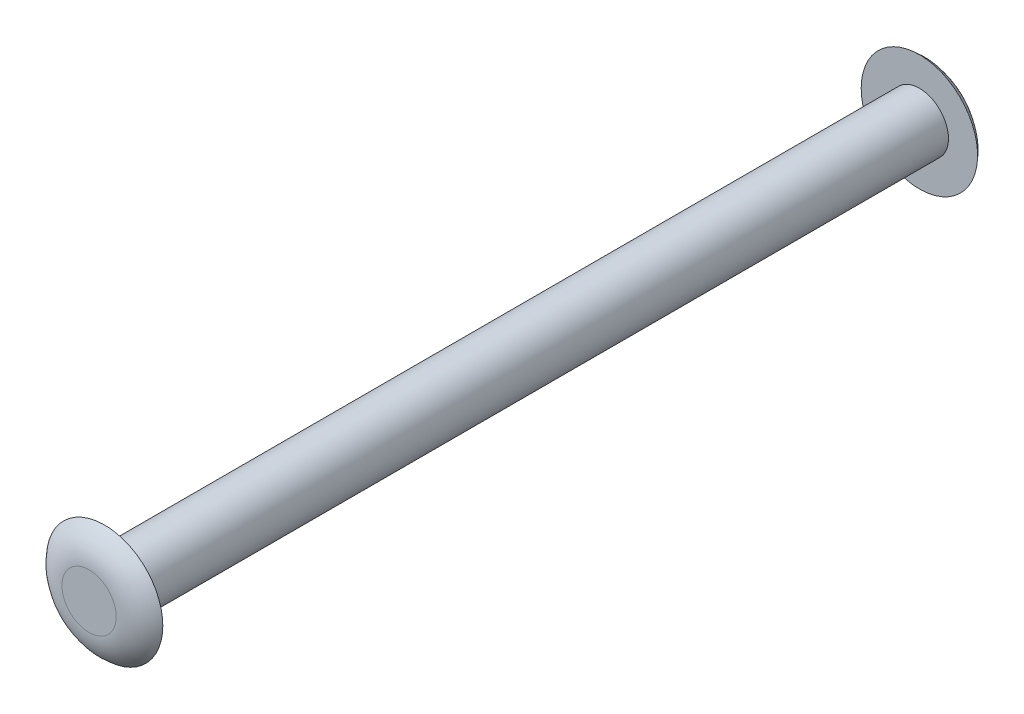
ISO-10303-21;
HEADER;
FILE_DESCRIPTION(('STEP AP214'),'2;1');
FILE_NAME('part.step','',(''),(''),'','','');
FILE_SCHEMA(('AUTOMOTIVE_DESIGN { 1 0 10303 214 1 1 1 1 }'));
ENDSEC;
DATA;
#1=APPLICATION_CONTEXT('core data for automotive mechanical design processes');
#2=APPLICATION_PROTOCOL_DEFINITION('international standard','automotive_design',2000,#1);
#3=PRODUCT_CONTEXT('',#1,'mechanical');
#4=PRODUCT('Part','Part','',(#3));
#5=PRODUCT_RELATED_PRODUCT_CATEGORY('part','',(#4));
#6=PRODUCT_DEFINITION_FORMATION('','',#4);
#7=PRODUCT_DEFINITION_CONTEXT('part definition',#1,'design');
#8=PRODUCT_DEFINITION('design','',#6,#7);
#9=PRODUCT_DEFINITION_SHAPE('','',#8);
#10=(LENGTH_UNIT() NAMED_UNIT(*) SI_UNIT(.MILLI.,.METRE.));
#11=(NAMED_UNIT(*) PLANE_ANGLE_UNIT() SI_UNIT($,.RADIAN.));
#12=(NAMED_UNIT(*) SI_UNIT($,.STERADIAN.) SOLID_ANGLE_UNIT());
#13=UNCERTAINTY_MEASURE_WITH_UNIT(LENGTH_MEASURE(1.E-05),#10,'distance_accuracy_value','');
#14=(GEOMETRIC_REPRESENTATION_CONTEXT(3) GLOBAL_UNCERTAINTY_ASSIGNED_CONTEXT((#13)) GLOBAL_UNIT_ASSIGNED_CONTEXT((#10,
#11,#12)) REPRESENTATION_CONTEXT('',''));
#15=CARTESIAN_POINT('',(0.,0.,0.));
#16=DIRECTION('',(0.,0.,1.));
#17=DIRECTION('',(1.,0.,0.));
#18=AXIS2_PLACEMENT_3D('',#15,#16,#17);
#19=CARTESIAN_POINT('',(0.,0.,105.));
#20=DIRECTION('',(0.,0.,-1.));
#21=DIRECTION('',(-1.,0.,0.));
#22=AXIS2_PLACEMENT_3D('',#19,#20,#21);
#23=CYLINDRICAL_SURFACE('',#22,3.75);
#24=CARTESIAN_POINT('',(0.,0.,105.));
#25=DIRECTION('',(0.,0.,1.));
#26=DIRECTION('',(1.,0.,0.));
#27=AXIS2_PLACEMENT_3D('',#24,#25,#26);
#28=CIRCLE('',#27,3.75);
#29=CARTESIAN_POINT('',(3.75,0.,105.));
#30=VERTEX_POINT('',#29);
#31=EDGE_CURVE('E42',#30,#30,#28,.T.);
#32=ORIENTED_EDGE('',*,*,#31,.F.);
#33=EDGE_LOOP('',(#32));
#34=FACE_BOUND('',#33,.T.);
#35=CARTESIAN_POINT('',(0.,0.,0.));
#36=DIRECTION('',(0.,0.,1.));
#37=DIRECTION('',(1.,0.,0.));
#38=AXIS2_PLACEMENT_3D('',#35,#36,#37);
#39=CIRCLE('',#38,3.75);
#40=CARTESIAN_POINT('',(3.75,0.,0.));
#41=VERTEX_POINT('',#40);
#42=EDGE_CURVE('E49',#41,#41,#39,.T.);
#43=ORIENTED_EDGE('',*,*,#42,.T.);
#44=EDGE_LOOP('',(#43));
#45=FACE_BOUND('',#44,.T.);
#46=ADVANCED_FACE('F31',(#34,#45),#23,.T.);
#47=CARTESIAN_POINT('',(0.,0.,107.));
#48=DIRECTION('',(0.,0.,1.));
#49=DIRECTION('',(1.,0.,0.));
#50=AXIS2_PLACEMENT_3D('',#47,#48,#49);
#51=PLANE('',#50);
#52=CARTESIAN_POINT('',(0.,0.,107.));
#53=DIRECTION('',(0.,0.,1.));
#54=DIRECTION('',(1.,0.,0.));
#55=AXIS2_PLACEMENT_3D('',#52,#53,#54);
#56=CIRCLE('',#55,3.5);
#57=CARTESIAN_POINT('',(3.5,0.,107.));
#58=VERTEX_POINT('',#57);
#59=EDGE_CURVE('E38',#58,#58,#56,.T.);
#60=ORIENTED_EDGE('',*,*,#59,.T.);
#61=EDGE_LOOP('',(#60));
#62=FACE_BOUND('',#61,.T.);
#63=ADVANCED_FACE('F76',(#62),#51,.T.);
#64=CARTESIAN_POINT('',(0.,0.,105.));
#65=DIRECTION('',(0.,0.,1.));
#66=DIRECTION('',(1.,0.,0.));
#67=AXIS2_PLACEMENT_3D('',#64,#65,#66);
#68=PLANE('',#67);
#69=ORIENTED_EDGE('',*,*,#31,.T.);
#70=EDGE_LOOP('',(#69));
#71=FACE_BOUND('',#70,.T.);
#72=CARTESIAN_POINT('',(0.,0.,105.));
#73=DIRECTION('',(0.,0.,1.));
#74=DIRECTION('',(1.,0.,0.));
#75=AXIS2_PLACEMENT_3D('',#72,#73,#74);
#76=CIRCLE('',#75,7.5);
#77=CARTESIAN_POINT('',(7.5,0.,105.));
#78=VERTEX_POINT('',#77);
#79=EDGE_CURVE('E46',#78,#78,#76,.T.);
#80=ORIENTED_EDGE('',*,*,#79,.F.);
#81=EDGE_LOOP('',(#80));
#82=FACE_BOUND('',#81,.T.);
#83=ADVANCED_FACE('F71',(#71,#82),#68,.F.);
#84=CARTESIAN_POINT('',(0.,0.,-2.));
#85=DIRECTION('',(0.,0.,-1.));
#86=DIRECTION('',(-1.,0.,0.));
#87=AXIS2_PLACEMENT_3D('',#84,#85,#86);
#88=PLANE('',#87);
#89=CARTESIAN_POINT('',(0.,0.,-2.));
#90=DIRECTION('',(0.,0.,-1.));
#91=DIRECTION('',(-1.,0.,0.));
#92=AXIS2_PLACEMENT_3D('',#89,#90,#91);
#93=CIRCLE('',#92,3.5);
#94=CARTESIAN_POINT('',(-3.5,0.,-2.));
#95=VERTEX_POINT('',#94);
#96=EDGE_CURVE('E10',#95,#95,#93,.T.);
#97=ORIENTED_EDGE('',*,*,#96,.T.);
#98=EDGE_LOOP('',(#97));
#99=FACE_BOUND('',#98,.T.);
#100=ADVANCED_FACE('F63',(#99),#88,.T.);
#101=CARTESIAN_POINT('',(0.,0.,0.));
#102=DIRECTION('',(0.,0.,-1.));
#103=DIRECTION('',(-1.,0.,0.));
#104=AXIS2_PLACEMENT_3D('',#101,#102,#103);
#105=PLANE('',#104);
#106=ORIENTED_EDGE('',*,*,#42,.F.);
#107=EDGE_LOOP('',(#106));
#108=FACE_BOUND('',#107,.T.);
#109=CARTESIAN_POINT('',(0.,0.,0.));
#110=DIRECTION('',(0.,0.,-1.));
#111=DIRECTION('',(-1.,0.,0.));
#112=AXIS2_PLACEMENT_3D('',#109,#110,#111);
#113=CIRCLE('',#112,7.5);
#114=CARTESIAN_POINT('',(-7.5,0.,0.));
#115=VERTEX_POINT('',#114);
#116=EDGE_CURVE('E51',#115,#115,#113,.T.);
#117=ORIENTED_EDGE('',*,*,#116,.F.);
#118=EDGE_LOOP('',(#117));
#119=FACE_BOUND('',#118,.T.);
#120=ADVANCED_FACE('F60',(#108,#119),#105,.F.);
#121=CARTESIAN_POINT('',(0.,0.,102.));
#122=DIRECTION('',(0.,0.,-1.));
#123=DIRECTION('',(-1.,0.,0.));
#124=AXIS2_PLACEMENT_3D('',#121,#122,#123);
#125=DEGENERATE_TOROIDAL_SURFACE('',#124,3.5,5.,.T.);
#126=ORIENTED_EDGE('',*,*,#79,.T.);
#127=EDGE_LOOP('',(#126));
#128=FACE_BOUND('',#127,.T.);
#129=ORIENTED_EDGE('',*,*,#59,.F.);
#130=EDGE_LOOP('',(#129));
#131=FACE_BOUND('',#130,.T.);
#132=ADVANCED_FACE('F62',(#128,#131),#125,.T.);
#133=CARTESIAN_POINT('',(0.,0.,3.));
#134=DIRECTION('',(0.,0.,1.));
#135=DIRECTION('',(1.,0.,0.));
#136=AXIS2_PLACEMENT_3D('',#133,#134,#135);
#137=DEGENERATE_TOROIDAL_SURFACE('',#136,3.5,5.,.T.);
#138=ORIENTED_EDGE('',*,*,#116,.T.);
#139=EDGE_LOOP('',(#138));
#140=FACE_BOUND('',#139,.T.);
#141=ORIENTED_EDGE('',*,*,#96,.F.);
#142=EDGE_LOOP('',(#141));
#143=FACE_BOUND('',#142,.T.);
#144=ADVANCED_FACE('F33',(#140,#143),#137,.T.);
#145=CLOSED_SHELL('',(#46,#63,#83,#100,#120,#132,#144));
#146=MANIFOLD_SOLID_BREP('B2',#145);
#147=ADVANCED_BREP_SHAPE_REPRESENTATION('',(#18,#146),#14);
#148=SHAPE_DEFINITION_REPRESENTATION(#9,#147);
ENDSEC;
END-ISO-10303-21;
